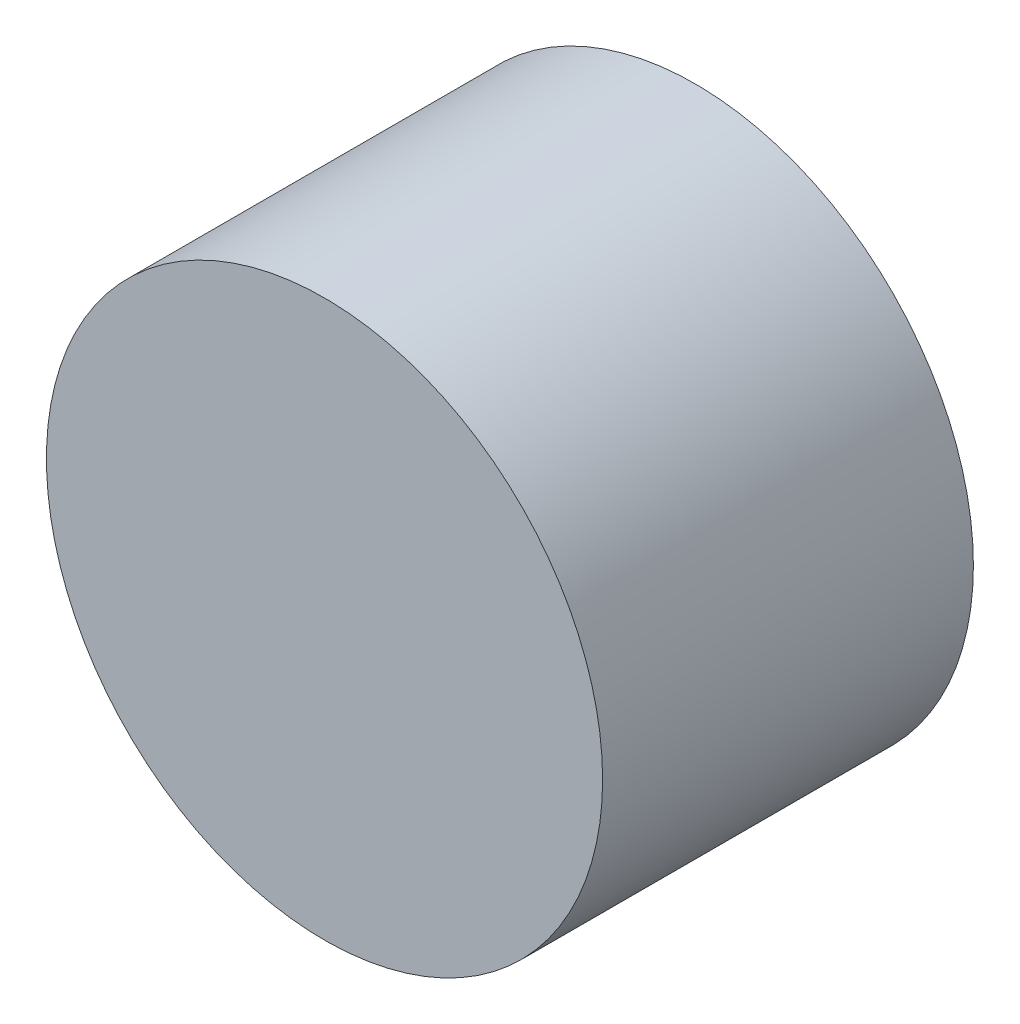
ISO-10303-21;
HEADER;
FILE_DESCRIPTION(('STEP AP214'),'2;1');
FILE_NAME('part.step','',(''),(''),'','','');
FILE_SCHEMA(('AUTOMOTIVE_DESIGN { 1 0 10303 214 1 1 1 1 }'));
ENDSEC;
DATA;
#1=APPLICATION_CONTEXT('core data for automotive mechanical design processes');
#2=APPLICATION_PROTOCOL_DEFINITION('international standard','automotive_design',2000,#1);
#3=PRODUCT_CONTEXT('',#1,'mechanical');
#4=PRODUCT('Part','Part','',(#3));
#5=PRODUCT_RELATED_PRODUCT_CATEGORY('part','',(#4));
#6=PRODUCT_DEFINITION_FORMATION('','',#4);
#7=PRODUCT_DEFINITION_CONTEXT('part definition',#1,'design');
#8=PRODUCT_DEFINITION('design','',#6,#7);
#9=PRODUCT_DEFINITION_SHAPE('','',#8);
#10=(LENGTH_UNIT() NAMED_UNIT(*) SI_UNIT(.MILLI.,.METRE.));
#11=(NAMED_UNIT(*) PLANE_ANGLE_UNIT() SI_UNIT($,.RADIAN.));
#12=(NAMED_UNIT(*) SI_UNIT($,.STERADIAN.) SOLID_ANGLE_UNIT());
#13=UNCERTAINTY_MEASURE_WITH_UNIT(LENGTH_MEASURE(1.E-05),#10,'distance_accuracy_value','');
#14=(GEOMETRIC_REPRESENTATION_CONTEXT(3) GLOBAL_UNCERTAINTY_ASSIGNED_CONTEXT((#13)) GLOBAL_UNIT_ASSIGNED_CONTEXT((#10,
#11,#12)) REPRESENTATION_CONTEXT('',''));
#15=CARTESIAN_POINT('',(0.,0.,0.));
#16=DIRECTION('',(0.,0.,1.));
#17=DIRECTION('',(1.,0.,0.));
#18=AXIS2_PLACEMENT_3D('',#15,#16,#17);
#19=CARTESIAN_POINT('',(0.,0.,100.));
#20=DIRECTION('',(0.,0.,-1.));
#21=DIRECTION('',(-1.,0.,0.));
#22=AXIS2_PLACEMENT_3D('',#19,#20,#21);
#23=CYLINDRICAL_SURFACE('',#22,75.);
#24=CARTESIAN_POINT('',(0.,0.,100.));
#25=DIRECTION('',(0.,0.,1.));
#26=DIRECTION('',(1.,0.,0.));
#27=AXIS2_PLACEMENT_3D('',#24,#25,#26);
#28=CIRCLE('',#27,75.);
#29=CARTESIAN_POINT('',(75.,0.,100.));
#30=VERTEX_POINT('',#29);
#31=EDGE_CURVE('E10',#30,#30,#28,.T.);
#32=ORIENTED_EDGE('',*,*,#31,.F.);
#33=EDGE_LOOP('',(#32));
#34=FACE_BOUND('',#33,.T.);
#35=CARTESIAN_POINT('',(0.,0.,0.));
#36=DIRECTION('',(0.,0.,1.));
#37=DIRECTION('',(1.,0.,0.));
#38=AXIS2_PLACEMENT_3D('',#35,#36,#37);
#39=CIRCLE('',#38,75.);
#40=CARTESIAN_POINT('',(75.,0.,0.));
#41=VERTEX_POINT('',#40);
#42=EDGE_CURVE('E34',#41,#41,#39,.T.);
#43=ORIENTED_EDGE('',*,*,#42,.T.);
#44=EDGE_LOOP('',(#43));
#45=FACE_BOUND('',#44,.T.);
#46=ADVANCED_FACE('F31',(#34,#45),#23,.T.);
#47=CARTESIAN_POINT('',(0.,0.,100.));
#48=DIRECTION('',(0.,0.,1.));
#49=DIRECTION('',(1.,0.,0.));
#50=AXIS2_PLACEMENT_3D('',#47,#48,#49);
#51=PLANE('',#50);
#52=ORIENTED_EDGE('',*,*,#31,.T.);
#53=EDGE_LOOP('',(#52));
#54=FACE_BOUND('',#53,.T.);
#55=ADVANCED_FACE('F62',(#54),#51,.T.);
#56=CARTESIAN_POINT('',(0.,0.,0.));
#57=DIRECTION('',(0.,0.,1.));
#58=DIRECTION('',(1.,0.,0.));
#59=AXIS2_PLACEMENT_3D('',#56,#57,#58);
#60=PLANE('',#59);
#61=CARTESIAN_POINT('',(0.,0.,0.));
#62=DIRECTION('',(0.,0.,1.));
#63=DIRECTION('',(1.,0.,0.));
#64=AXIS2_PLACEMENT_3D('',#61,#62,#63);
#65=CIRCLE('',#64,65.);
#66=CARTESIAN_POINT('',(65.,0.,0.));
#67=VERTEX_POINT('',#66);
#68=EDGE_CURVE('E43',#67,#67,#65,.T.);
#69=ORIENTED_EDGE('',*,*,#68,.T.);
#70=EDGE_LOOP('',(#69));
#71=FACE_BOUND('',#70,.T.);
#72=ORIENTED_EDGE('',*,*,#42,.F.);
#73=EDGE_LOOP('',(#72));
#74=FACE_BOUND('',#73,.T.);
#75=ADVANCED_FACE('F58',(#71,#74),#60,.F.);
#76=CARTESIAN_POINT('',(0.,0.,100.));
#77=DIRECTION('',(0.,0.,-1.));
#78=DIRECTION('',(-1.,0.,0.));
#79=AXIS2_PLACEMENT_3D('',#76,#77,#78);
#80=CYLINDRICAL_SURFACE('',#79,65.);
#81=CARTESIAN_POINT('',(0.,0.,90.));
#82=DIRECTION('',(0.,0.,1.));
#83=DIRECTION('',(1.,0.,0.));
#84=AXIS2_PLACEMENT_3D('',#81,#82,#83);
#85=CIRCLE('',#84,65.);
#86=CARTESIAN_POINT('',(65.,0.,90.));
#87=VERTEX_POINT('',#86);
#88=EDGE_CURVE('E41',#87,#87,#85,.T.);
#89=ORIENTED_EDGE('',*,*,#88,.T.);
#90=EDGE_LOOP('',(#89));
#91=FACE_BOUND('',#90,.T.);
#92=ORIENTED_EDGE('',*,*,#68,.F.);
#93=EDGE_LOOP('',(#92));
#94=FACE_BOUND('',#93,.T.);
#95=ADVANCED_FACE('F49',(#91,#94),#80,.F.);
#96=CARTESIAN_POINT('',(0.,0.,90.));
#97=DIRECTION('',(0.,0.,1.));
#98=DIRECTION('',(1.,0.,0.));
#99=AXIS2_PLACEMENT_3D('',#96,#97,#98);
#100=PLANE('',#99);
#101=ORIENTED_EDGE('',*,*,#88,.F.);
#102=EDGE_LOOP('',(#101));
#103=FACE_BOUND('',#102,.T.);
#104=ADVANCED_FACE('F52',(#103),#100,.F.);
#105=CLOSED_SHELL('',(#46,#55,#75,#95,#104));
#106=MANIFOLD_SOLID_BREP('B2',#105);
#107=ADVANCED_BREP_SHAPE_REPRESENTATION('',(#18,#106),#14);
#108=SHAPE_DEFINITION_REPRESENTATION(#9,#107);
ENDSEC;
END-ISO-10303-21;
